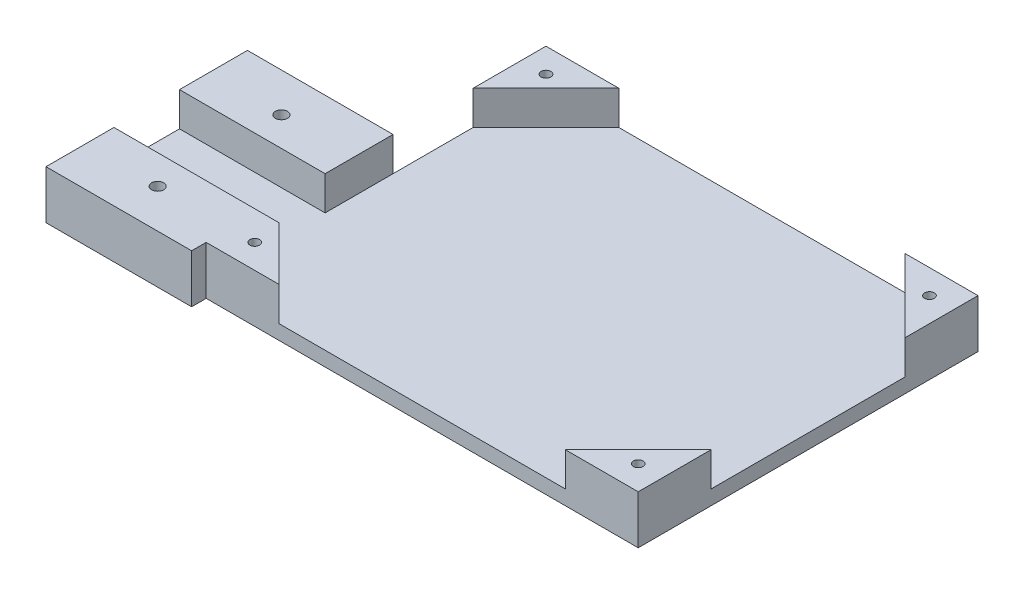
ISO-10303-21;
HEADER;
FILE_DESCRIPTION(('STEP AP214'),'2;1');
FILE_NAME('part.step','',(''),(''),'','','');
FILE_SCHEMA(('AUTOMOTIVE_DESIGN { 1 0 10303 214 1 1 1 1 }'));
ENDSEC;
DATA;
#1=APPLICATION_CONTEXT('core data for automotive mechanical design processes');
#2=APPLICATION_PROTOCOL_DEFINITION('international standard','automotive_design',2000,#1);
#3=PRODUCT_CONTEXT('',#1,'mechanical');
#4=PRODUCT('Part','Part','',(#3));
#5=PRODUCT_RELATED_PRODUCT_CATEGORY('part','',(#4));
#6=PRODUCT_DEFINITION_FORMATION('','',#4);
#7=PRODUCT_DEFINITION_CONTEXT('part definition',#1,'design');
#8=PRODUCT_DEFINITION('design','',#6,#7);
#9=PRODUCT_DEFINITION_SHAPE('','',#8);
#10=(LENGTH_UNIT() NAMED_UNIT(*) SI_UNIT(.MILLI.,.METRE.));
#11=(NAMED_UNIT(*) PLANE_ANGLE_UNIT() SI_UNIT($,.RADIAN.));
#12=(NAMED_UNIT(*) SI_UNIT($,.STERADIAN.) SOLID_ANGLE_UNIT());
#13=UNCERTAINTY_MEASURE_WITH_UNIT(LENGTH_MEASURE(1.E-05),#10,'distance_accuracy_value','');
#14=(GEOMETRIC_REPRESENTATION_CONTEXT(3) GLOBAL_UNCERTAINTY_ASSIGNED_CONTEXT((#13)) GLOBAL_UNIT_ASSIGNED_CONTEXT((#10,
#11,#12)) REPRESENTATION_CONTEXT('',''));
#15=CARTESIAN_POINT('',(0.,0.,0.));
#16=DIRECTION('',(0.,0.,1.));
#17=DIRECTION('',(1.,0.,0.));
#18=AXIS2_PLACEMENT_3D('',#15,#16,#17);
#19=CARTESIAN_POINT('',(0.,10.,0.));
#20=DIRECTION('',(0.,-1.,0.));
#21=DIRECTION('',(0.,0.,-1.));
#22=AXIS2_PLACEMENT_3D('',#19,#20,#21);
#23=PLANE('',#22);
#24=CARTESIAN_POINT('',(-59.5,10.,4.50000000000001));
#25=DIRECTION('',(0.,-1.,0.));
#26=DIRECTION('',(0.,0.,-1.));
#27=AXIS2_PLACEMENT_3D('',#24,#25,#26);
#28=CIRCLE('',#27,1.25);
#29=CARTESIAN_POINT('',(-59.5,10.,3.25));
#30=VERTEX_POINT('',#29);
#31=EDGE_CURVE('E198',#30,#30,#28,.T.);
#32=ORIENTED_EDGE('',*,*,#31,.T.);
#33=EDGE_LOOP('',(#32));
#34=FACE_BOUND('',#33,.T.);
#35=DIRECTION('',(0.,0.,-1.));
#36=VECTOR('',#35,1.);
#37=CARTESIAN_POINT('',(-74.5,10.,-3.49999999999999));
#38=LINE('',#37,#36);
#39=CARTESIAN_POINT('',(-74.5,10.,10.5));
#40=VERTEX_POINT('',#39);
#41=CARTESIAN_POINT('',(-74.5,10.,-3.49999999999999));
#42=VERTEX_POINT('',#41);
#43=EDGE_CURVE('E217',#40,#42,#38,.T.);
#44=ORIENTED_EDGE('',*,*,#43,.F.);
#45=DIRECTION('',(-1.,0.,0.));
#46=VECTOR('',#45,1.);
#47=CARTESIAN_POINT('',(-74.5,10.,10.5));
#48=LINE('',#47,#46);
#49=CARTESIAN_POINT('',(-44.5,10.,10.5));
#50=VERTEX_POINT('',#49);
#51=EDGE_CURVE('E184',#50,#40,#48,.T.);
#52=ORIENTED_EDGE('',*,*,#51,.F.);
#53=DIRECTION('',(0.,0.,1.));
#54=VECTOR('',#53,1.);
#55=CARTESIAN_POINT('',(-44.5,10.,-3.49999999999999));
#56=LINE('',#55,#54);
#57=CARTESIAN_POINT('',(-44.5,10.,-3.49999999999999));
#58=VERTEX_POINT('',#57);
#59=EDGE_CURVE('E210',#58,#50,#56,.T.);
#60=ORIENTED_EDGE('',*,*,#59,.F.);
#61=DIRECTION('',(1.,0.,0.));
#62=VECTOR('',#61,1.);
#63=CARTESIAN_POINT('',(-44.5,10.,-3.49999999999999));
#64=LINE('',#63,#62);
#65=EDGE_CURVE('E219',#42,#58,#64,.T.);
#66=ORIENTED_EDGE('',*,*,#65,.F.);
#67=EDGE_LOOP('',(#44,#52,#60,#66));
#68=FACE_BOUND('',#67,.T.);
#69=ADVANCED_FACE('F33',(#34,#68),#23,.F.);
#70=CARTESIAN_POINT('',(-44.5,10.,35.));
#71=DIRECTION('',(1.,0.,0.));
#72=DIRECTION('',(0.,0.,-1.));
#73=AXIS2_PLACEMENT_3D('',#70,#71,#72);
#74=PLANE('',#73);
#75=DIRECTION('',(0.,-1.,0.));
#76=VECTOR('',#75,1.);
#77=CARTESIAN_POINT('',(-44.5,10.,-3.49999999999999));
#78=LINE('',#77,#76);
#79=CARTESIAN_POINT('',(-44.5,3.,-3.49999999999999));
#80=VERTEX_POINT('',#79);
#81=CARTESIAN_POINT('',(-44.5,0.,-3.49999999999999));
#82=VERTEX_POINT('',#81);
#83=EDGE_CURVE('E11',#80,#82,#78,.T.);
#84=ORIENTED_EDGE('',*,*,#83,.F.);
#85=DIRECTION('',(0.,0.,1.));
#86=VECTOR('',#85,1.);
#87=CARTESIAN_POINT('',(-44.5,3.,-19.9999999999999));
#88=LINE('',#87,#86);
#89=CARTESIAN_POINT('',(-44.5,3.,-19.9999999999999));
#90=VERTEX_POINT('',#89);
#91=EDGE_CURVE('E241',#90,#80,#88,.T.);
#92=ORIENTED_EDGE('',*,*,#91,.F.);
#93=DIRECTION('',(0.,1.,0.));
#94=VECTOR('',#93,1.);
#95=CARTESIAN_POINT('',(-44.5,3.,-19.9999999999999));
#96=LINE('',#95,#94);
#97=CARTESIAN_POINT('',(-44.5,10.,-19.9999999999999));
#98=VERTEX_POINT('',#97);
#99=EDGE_CURVE('E271',#90,#98,#96,.T.);
#100=ORIENTED_EDGE('',*,*,#99,.T.);
#101=DIRECTION('',(0.,0.,1.));
#102=VECTOR('',#101,1.);
#103=CARTESIAN_POINT('',(-44.5,10.,35.));
#104=LINE('',#103,#102);
#105=CARTESIAN_POINT('',(-44.5,10.,-35.));
#106=VERTEX_POINT('',#105);
#107=EDGE_CURVE('E321',#106,#98,#104,.T.);
#108=ORIENTED_EDGE('',*,*,#107,.F.);
#109=DIRECTION('',(0.,-1.,0.));
#110=VECTOR('',#109,1.);
#111=CARTESIAN_POINT('',(-44.5,10.,-35.));
#112=LINE('',#111,#110);
#113=CARTESIAN_POINT('',(-44.5,0.,-35.));
#114=VERTEX_POINT('',#113);
#115=EDGE_CURVE('E340',#106,#114,#112,.T.);
#116=ORIENTED_EDGE('',*,*,#115,.T.);
#117=DIRECTION('',(0.,0.,1.));
#118=VECTOR('',#117,1.);
#119=CARTESIAN_POINT('',(-44.5,0.,35.));
#120=LINE('',#119,#118);
#121=EDGE_CURVE('E333',#114,#82,#120,.T.);
#122=ORIENTED_EDGE('',*,*,#121,.T.);
#123=EDGE_LOOP('',(#84,#92,#100,#108,#116,#122));
#124=FACE_BOUND('',#123,.T.);
#125=ADVANCED_FACE('F362',(#124),#74,.F.);
#126=CARTESIAN_POINT('',(-39.5,10.,-30.));
#127=DIRECTION('',(0.,1.,0.));
#128=DIRECTION('',(0.,0.,1.));
#129=AXIS2_PLACEMENT_3D('',#126,#127,#128);
#130=CIRCLE('',#129,0.999999999999998);
#131=CARTESIAN_POINT('',(-39.5,10.,-29.));
#132=VERTEX_POINT('',#131);
#133=EDGE_CURVE('E307',#132,#132,#130,.T.);
#134=ORIENTED_EDGE('',*,*,#133,.F.);
#135=EDGE_LOOP('',(#134));
#136=FACE_BOUND('',#135,.T.);
#137=ORIENTED_EDGE('',*,*,#107,.T.);
#138=DIRECTION('',(-0.707106781186544,0.,0.707106781186551));
#139=VECTOR('',#138,1.);
#140=CARTESIAN_POINT('',(-29.5000000000001,10.,-35.));
#141=LINE('',#140,#139);
#142=CARTESIAN_POINT('',(-29.5000000000001,10.,-35.));
#143=VERTEX_POINT('',#142);
#144=EDGE_CURVE('E269',#143,#98,#141,.T.);
#145=ORIENTED_EDGE('',*,*,#144,.F.);
#146=DIRECTION('',(-1.,0.,0.));
#147=VECTOR('',#146,1.);
#148=CARTESIAN_POINT('',(-44.5,10.,-35.));
#149=LINE('',#148,#147);
#150=EDGE_CURVE('E316',#143,#106,#149,.T.);
#151=ORIENTED_EDGE('',*,*,#150,.T.);
#152=EDGE_LOOP('',(#137,#145,#151));
#153=FACE_BOUND('',#152,.T.);
#154=ADVANCED_FACE('F412',(#136,#153),#23,.F.);
#155=CARTESIAN_POINT('',(39.5,10.,-30.));
#156=DIRECTION('',(0.,1.,0.));
#157=DIRECTION('',(0.,0.,-1.));
#158=AXIS2_PLACEMENT_3D('',#155,#156,#157);
#159=CIRCLE('',#158,0.999999999999998);
#160=CARTESIAN_POINT('',(39.5,10.,-31.));
#161=VERTEX_POINT('',#160);
#162=EDGE_CURVE('E301',#161,#161,#159,.T.);
#163=ORIENTED_EDGE('',*,*,#162,.F.);
#164=EDGE_LOOP('',(#163));
#165=FACE_BOUND('',#164,.T.);
#166=CARTESIAN_POINT('',(44.5,10.,-35.));
#167=VERTEX_POINT('',#166);
#168=CARTESIAN_POINT('',(29.4999999999999,10.,-35.));
#169=VERTEX_POINT('',#168);
#170=EDGE_CURVE('E318',#167,#169,#149,.T.);
#171=ORIENTED_EDGE('',*,*,#170,.T.);
#172=DIRECTION('',(-0.707106781186549,0.,-0.707106781186546));
#173=VECTOR('',#172,1.);
#174=CARTESIAN_POINT('',(44.5,10.,-20.));
#175=LINE('',#174,#173);
#176=CARTESIAN_POINT('',(44.5,10.,-20.));
#177=VERTEX_POINT('',#176);
#178=EDGE_CURVE('E267',#177,#169,#175,.T.);
#179=ORIENTED_EDGE('',*,*,#178,.F.);
#180=DIRECTION('',(0.,0.,-1.));
#181=VECTOR('',#180,1.);
#182=CARTESIAN_POINT('',(44.5,10.,35.));
#183=LINE('',#182,#181);
#184=EDGE_CURVE('E317',#177,#167,#183,.T.);
#185=ORIENTED_EDGE('',*,*,#184,.T.);
#186=EDGE_LOOP('',(#171,#179,#185));
#187=FACE_BOUND('',#186,.T.);
#188=ADVANCED_FACE('F414',(#165,#187),#23,.F.);
#189=CARTESIAN_POINT('',(39.5,10.,30.));
#190=DIRECTION('',(0.,1.,0.));
#191=DIRECTION('',(0.,0.,1.));
#192=AXIS2_PLACEMENT_3D('',#189,#190,#191);
#193=CIRCLE('',#192,0.999999999999998);
#194=CARTESIAN_POINT('',(39.5,10.,31.));
#195=VERTEX_POINT('',#194);
#196=EDGE_CURVE('E295',#195,#195,#193,.T.);
#197=ORIENTED_EDGE('',*,*,#196,.F.);
#198=EDGE_LOOP('',(#197));
#199=FACE_BOUND('',#198,.T.);
#200=CARTESIAN_POINT('',(44.5,10.,35.));
#201=VERTEX_POINT('',#200);
#202=CARTESIAN_POINT('',(44.5,10.,20.));
#203=VERTEX_POINT('',#202);
#204=EDGE_CURVE('E313',#201,#203,#183,.T.);
#205=ORIENTED_EDGE('',*,*,#204,.T.);
#206=DIRECTION('',(0.707106781186546,0.,-0.707106781186549));
#207=VECTOR('',#206,1.);
#208=CARTESIAN_POINT('',(29.5,10.,35.));
#209=LINE('',#208,#207);
#210=CARTESIAN_POINT('',(29.5,10.,35.));
#211=VERTEX_POINT('',#210);
#212=EDGE_CURVE('E265',#211,#203,#209,.T.);
#213=ORIENTED_EDGE('',*,*,#212,.F.);
#214=DIRECTION('',(1.,0.,0.));
#215=VECTOR('',#214,1.);
#216=CARTESIAN_POINT('',(-44.5,10.,35.));
#217=LINE('',#216,#215);
#218=EDGE_CURVE('E324',#211,#201,#217,.T.);
#219=ORIENTED_EDGE('',*,*,#218,.T.);
#220=EDGE_LOOP('',(#205,#213,#219));
#221=FACE_BOUND('',#220,.T.);
#222=ADVANCED_FACE('F402',(#199,#221),#23,.F.);
#223=DIRECTION('',(0.707106781186549,0.,0.707106781186546));
#224=VECTOR('',#223,1.);
#225=CARTESIAN_POINT('',(-44.5,10.,20.));
#226=LINE('',#225,#224);
#227=CARTESIAN_POINT('',(-40.5,10.,24.));
#228=VERTEX_POINT('',#227);
#229=CARTESIAN_POINT('',(-29.4999999999999,10.,35.));
#230=VERTEX_POINT('',#229);
#231=EDGE_CURVE('E234',#228,#230,#226,.T.);
#232=ORIENTED_EDGE('',*,*,#231,.F.);
#233=DIRECTION('',(1.,0.,0.));
#234=VECTOR('',#233,1.);
#235=CARTESIAN_POINT('',(-74.5,10.,24.));
#236=LINE('',#235,#234);
#237=CARTESIAN_POINT('',(-74.5,10.,24.));
#238=VERTEX_POINT('',#237);
#239=EDGE_CURVE('E375',#238,#228,#236,.T.);
#240=ORIENTED_EDGE('',*,*,#239,.F.);
#241=CARTESIAN_POINT('',(-74.5,10.,38.));
#242=VERTEX_POINT('',#241);
#243=EDGE_CURVE('E189',#242,#238,#38,.T.);
#244=ORIENTED_EDGE('',*,*,#243,.F.);
#245=DIRECTION('',(-1.,0.,0.));
#246=VECTOR('',#245,1.);
#247=CARTESIAN_POINT('',(-44.5,10.,38.));
#248=LINE('',#247,#246);
#249=CARTESIAN_POINT('',(-44.5,10.,38.));
#250=VERTEX_POINT('',#249);
#251=EDGE_CURVE('E213',#250,#242,#248,.T.);
#252=ORIENTED_EDGE('',*,*,#251,.F.);
#253=CARTESIAN_POINT('',(-44.5,10.,35.));
#254=VERTEX_POINT('',#253);
#255=EDGE_CURVE('E214',#254,#250,#56,.T.);
#256=ORIENTED_EDGE('',*,*,#255,.F.);
#257=EDGE_CURVE('E325',#254,#230,#217,.T.);
#258=ORIENTED_EDGE('',*,*,#257,.T.);
#259=EDGE_LOOP('',(#232,#240,#244,#252,#256,#258));
#260=FACE_BOUND('',#259,.T.);
#261=CARTESIAN_POINT('',(-39.5,10.,30.));
#262=DIRECTION('',(0.,1.,0.));
#263=DIRECTION('',(0.,0.,-1.));
#264=AXIS2_PLACEMENT_3D('',#261,#262,#263);
#265=CIRCLE('',#264,0.999999999999998);
#266=CARTESIAN_POINT('',(-39.5,10.,29.));
#267=VERTEX_POINT('',#266);
#268=EDGE_CURVE('E289',#267,#267,#265,.T.);
#269=ORIENTED_EDGE('',*,*,#268,.F.);
#270=EDGE_LOOP('',(#269));
#271=FACE_BOUND('',#270,.T.);
#272=CARTESIAN_POINT('',(-59.5,10.,30.));
#273=DIRECTION('',(0.,-1.,0.));
#274=DIRECTION('',(0.,0.,-1.));
#275=AXIS2_PLACEMENT_3D('',#272,#273,#274);
#276=CIRCLE('',#275,1.25);
#277=CARTESIAN_POINT('',(-59.5,10.,28.75));
#278=VERTEX_POINT('',#277);
#279=EDGE_CURVE('E204',#278,#278,#276,.T.);
#280=ORIENTED_EDGE('',*,*,#279,.T.);
#281=EDGE_LOOP('',(#280));
#282=FACE_BOUND('',#281,.T.);
#283=ADVANCED_FACE('F386',(#260,#271,#282),#23,.F.);
#284=CARTESIAN_POINT('',(0.,0.,0.));
#285=DIRECTION('',(0.,-1.,0.));
#286=DIRECTION('',(0.,0.,-1.));
#287=AXIS2_PLACEMENT_3D('',#284,#285,#286);
#288=PLANE('',#287);
#289=CARTESIAN_POINT('',(39.5,0.,30.));
#290=DIRECTION('',(0.,1.,0.));
#291=DIRECTION('',(0.,0.,1.));
#292=AXIS2_PLACEMENT_3D('',#289,#290,#291);
#293=CIRCLE('',#292,0.999999999999998);
#294=CARTESIAN_POINT('',(39.5,0.,31.));
#295=VERTEX_POINT('',#294);
#296=EDGE_CURVE('E292',#295,#295,#293,.T.);
#297=ORIENTED_EDGE('',*,*,#296,.T.);
#298=EDGE_LOOP('',(#297));
#299=FACE_BOUND('',#298,.T.);
#300=CARTESIAN_POINT('',(-39.5,0.,-30.));
#301=DIRECTION('',(0.,1.,0.));
#302=DIRECTION('',(0.,0.,1.));
#303=AXIS2_PLACEMENT_3D('',#300,#301,#302);
#304=CIRCLE('',#303,0.999999999999998);
#305=CARTESIAN_POINT('',(-39.5,0.,-29.));
#306=VERTEX_POINT('',#305);
#307=EDGE_CURVE('E304',#306,#306,#304,.T.);
#308=ORIENTED_EDGE('',*,*,#307,.T.);
#309=EDGE_LOOP('',(#308));
#310=FACE_BOUND('',#309,.T.);
#311=DIRECTION('',(0.,0.,-1.));
#312=VECTOR('',#311,1.);
#313=CARTESIAN_POINT('',(44.5,0.,35.));
#314=LINE('',#313,#312);
#315=CARTESIAN_POINT('',(44.5,0.,35.));
#316=VERTEX_POINT('',#315);
#317=CARTESIAN_POINT('',(44.5,0.,-35.));
#318=VERTEX_POINT('',#317);
#319=EDGE_CURVE('E310',#316,#318,#314,.T.);
#320=ORIENTED_EDGE('',*,*,#319,.F.);
#321=DIRECTION('',(1.,0.,0.));
#322=VECTOR('',#321,1.);
#323=CARTESIAN_POINT('',(-44.5,0.,35.));
#324=LINE('',#323,#322);
#325=CARTESIAN_POINT('',(-44.5,0.,35.));
#326=VERTEX_POINT('',#325);
#327=EDGE_CURVE('E335',#326,#316,#324,.T.);
#328=ORIENTED_EDGE('',*,*,#327,.F.);
#329=DIRECTION('',(0.,0.,1.));
#330=VECTOR('',#329,1.);
#331=CARTESIAN_POINT('',(-44.5,0.,-3.49999999999999));
#332=LINE('',#331,#330);
#333=CARTESIAN_POINT('',(-44.5,0.,38.));
#334=VERTEX_POINT('',#333);
#335=EDGE_CURVE('E207',#326,#334,#332,.T.);
#336=ORIENTED_EDGE('',*,*,#335,.T.);
#337=DIRECTION('',(-1.,0.,0.));
#338=VECTOR('',#337,1.);
#339=CARTESIAN_POINT('',(-44.5,0.,38.));
#340=LINE('',#339,#338);
#341=CARTESIAN_POINT('',(-74.5,0.,38.));
#342=VERTEX_POINT('',#341);
#343=EDGE_CURVE('E224',#334,#342,#340,.T.);
#344=ORIENTED_EDGE('',*,*,#343,.T.);
#345=DIRECTION('',(0.,0.,-1.));
#346=VECTOR('',#345,1.);
#347=CARTESIAN_POINT('',(-74.5,0.,-3.49999999999999));
#348=LINE('',#347,#346);
#349=CARTESIAN_POINT('',(-74.5,0.,-3.49999999999999));
#350=VERTEX_POINT('',#349);
#351=EDGE_CURVE('E227',#342,#350,#348,.T.);
#352=ORIENTED_EDGE('',*,*,#351,.T.);
#353=DIRECTION('',(1.,0.,0.));
#354=VECTOR('',#353,1.);
#355=CARTESIAN_POINT('',(-44.5,0.,-3.49999999999999));
#356=LINE('',#355,#354);
#357=EDGE_CURVE('E230',#350,#82,#356,.T.);
#358=ORIENTED_EDGE('',*,*,#357,.T.);
#359=ORIENTED_EDGE('',*,*,#121,.F.);
#360=DIRECTION('',(-1.,0.,0.));
#361=VECTOR('',#360,1.);
#362=CARTESIAN_POINT('',(-44.5,0.,-35.));
#363=LINE('',#362,#361);
#364=EDGE_CURVE('E331',#318,#114,#363,.T.);
#365=ORIENTED_EDGE('',*,*,#364,.F.);
#366=EDGE_LOOP('',(#320,#328,#336,#344,#352,#358,#359,#365));
#367=FACE_BOUND('',#366,.T.);
#368=CARTESIAN_POINT('',(39.5,0.,-30.));
#369=DIRECTION('',(0.,1.,0.));
#370=DIRECTION('',(0.,0.,-1.));
#371=AXIS2_PLACEMENT_3D('',#368,#369,#370);
#372=CIRCLE('',#371,0.999999999999998);
#373=CARTESIAN_POINT('',(39.5,0.,-31.));
#374=VERTEX_POINT('',#373);
#375=EDGE_CURVE('E298',#374,#374,#372,.T.);
#376=ORIENTED_EDGE('',*,*,#375,.T.);
#377=EDGE_LOOP('',(#376));
#378=FACE_BOUND('',#377,.T.);
#379=CARTESIAN_POINT('',(-39.5,0.,30.));
#380=DIRECTION('',(0.,1.,0.));
#381=DIRECTION('',(0.,0.,-1.));
#382=AXIS2_PLACEMENT_3D('',#379,#380,#381);
#383=CIRCLE('',#382,0.999999999999998);
#384=CARTESIAN_POINT('',(-39.5,0.,29.));
#385=VERTEX_POINT('',#384);
#386=EDGE_CURVE('E274',#385,#385,#383,.T.);
#387=ORIENTED_EDGE('',*,*,#386,.T.);
#388=EDGE_LOOP('',(#387));
#389=FACE_BOUND('',#388,.T.);
#390=CARTESIAN_POINT('',(-59.5,0.,4.50000000000001));
#391=DIRECTION('',(0.,-1.,0.));
#392=DIRECTION('',(0.,0.,-1.));
#393=AXIS2_PLACEMENT_3D('',#390,#391,#392);
#394=CIRCLE('',#393,1.25);
#395=CARTESIAN_POINT('',(-59.5,0.,3.25));
#396=VERTEX_POINT('',#395);
#397=EDGE_CURVE('E197',#396,#396,#394,.T.);
#398=ORIENTED_EDGE('',*,*,#397,.F.);
#399=EDGE_LOOP('',(#398));
#400=FACE_BOUND('',#399,.T.);
#401=CARTESIAN_POINT('',(-59.5,0.,30.));
#402=DIRECTION('',(0.,-1.,0.));
#403=DIRECTION('',(0.,0.,-1.));
#404=AXIS2_PLACEMENT_3D('',#401,#402,#403);
#405=CIRCLE('',#404,1.25);
#406=CARTESIAN_POINT('',(-59.5,0.,28.75));
#407=VERTEX_POINT('',#406);
#408=EDGE_CURVE('E201',#407,#407,#405,.T.);
#409=ORIENTED_EDGE('',*,*,#408,.F.);
#410=EDGE_LOOP('',(#409));
#411=FACE_BOUND('',#410,.T.);
#412=ADVANCED_FACE('F358',(#299,#310,#367,#378,#389,#400,#411),#288,.T.);
#413=CARTESIAN_POINT('',(44.5,10.,35.));
#414=DIRECTION('',(-1.,0.,0.));
#415=DIRECTION('',(0.,0.,1.));
#416=AXIS2_PLACEMENT_3D('',#413,#414,#415);
#417=PLANE('',#416);
#418=ORIENTED_EDGE('',*,*,#184,.F.);
#419=DIRECTION('',(0.,1.,0.));
#420=VECTOR('',#419,1.);
#421=CARTESIAN_POINT('',(44.5,3.,-20.));
#422=LINE('',#421,#420);
#423=CARTESIAN_POINT('',(44.5,3.,-20.));
#424=VERTEX_POINT('',#423);
#425=EDGE_CURVE('E280',#424,#177,#422,.T.);
#426=ORIENTED_EDGE('',*,*,#425,.F.);
#427=DIRECTION('',(0.,0.,-1.));
#428=VECTOR('',#427,1.);
#429=CARTESIAN_POINT('',(44.5,3.,20.));
#430=LINE('',#429,#428);
#431=CARTESIAN_POINT('',(44.5,3.,20.));
#432=VERTEX_POINT('',#431);
#433=EDGE_CURVE('E252',#432,#424,#430,.T.);
#434=ORIENTED_EDGE('',*,*,#433,.F.);
#435=DIRECTION('',(0.,1.,0.));
#436=VECTOR('',#435,1.);
#437=CARTESIAN_POINT('',(44.5,3.,20.));
#438=LINE('',#437,#436);
#439=EDGE_CURVE('E282',#432,#203,#438,.T.);
#440=ORIENTED_EDGE('',*,*,#439,.T.);
#441=ORIENTED_EDGE('',*,*,#204,.F.);
#442=DIRECTION('',(0.,-1.,0.));
#443=VECTOR('',#442,1.);
#444=CARTESIAN_POINT('',(44.5,10.,35.));
#445=LINE('',#444,#443);
#446=EDGE_CURVE('E328',#201,#316,#445,.T.);
#447=ORIENTED_EDGE('',*,*,#446,.T.);
#448=ORIENTED_EDGE('',*,*,#319,.T.);
#449=DIRECTION('',(0.,-1.,0.));
#450=VECTOR('',#449,1.);
#451=CARTESIAN_POINT('',(44.5,10.,-35.));
#452=LINE('',#451,#450);
#453=EDGE_CURVE('E37',#167,#318,#452,.T.);
#454=ORIENTED_EDGE('',*,*,#453,.F.);
#455=EDGE_LOOP('',(#418,#426,#434,#440,#441,#447,#448,#454));
#456=FACE_BOUND('',#455,.T.);
#457=ADVANCED_FACE('F35',(#456),#417,.F.);
#458=CARTESIAN_POINT('',(-44.5,10.,-35.));
#459=DIRECTION('',(0.,0.,1.));
#460=DIRECTION('',(1.,0.,0.));
#461=AXIS2_PLACEMENT_3D('',#458,#459,#460);
#462=PLANE('',#461);
#463=ORIENTED_EDGE('',*,*,#150,.F.);
#464=DIRECTION('',(0.,1.,0.));
#465=VECTOR('',#464,1.);
#466=CARTESIAN_POINT('',(-29.5000000000001,3.,-35.));
#467=LINE('',#466,#465);
#468=CARTESIAN_POINT('',(-29.5000000000001,3.,-35.));
#469=VERTEX_POINT('',#468);
#470=EDGE_CURVE('E275',#469,#143,#467,.T.);
#471=ORIENTED_EDGE('',*,*,#470,.F.);
#472=DIRECTION('',(-1.,0.,0.));
#473=VECTOR('',#472,1.);
#474=CARTESIAN_POINT('',(29.4999999999999,3.,-35.));
#475=LINE('',#474,#473);
#476=CARTESIAN_POINT('',(29.4999999999999,3.,-35.));
#477=VERTEX_POINT('',#476);
#478=EDGE_CURVE('E258',#477,#469,#475,.T.);
#479=ORIENTED_EDGE('',*,*,#478,.F.);
#480=DIRECTION('',(0.,1.,0.));
#481=VECTOR('',#480,1.);
#482=CARTESIAN_POINT('',(29.4999999999999,3.,-35.));
#483=LINE('',#482,#481);
#484=EDGE_CURVE('E277',#477,#169,#483,.T.);
#485=ORIENTED_EDGE('',*,*,#484,.T.);
#486=ORIENTED_EDGE('',*,*,#170,.F.);
#487=ORIENTED_EDGE('',*,*,#453,.T.);
#488=ORIENTED_EDGE('',*,*,#364,.T.);
#489=ORIENTED_EDGE('',*,*,#115,.F.);
#490=EDGE_LOOP('',(#463,#471,#479,#485,#486,#487,#488,#489));
#491=FACE_BOUND('',#490,.T.);
#492=ADVANCED_FACE('F350',(#491),#462,.F.);
#493=CARTESIAN_POINT('',(-44.5,10.,35.));
#494=DIRECTION('',(0.,0.,-1.));
#495=DIRECTION('',(-1.,0.,0.));
#496=AXIS2_PLACEMENT_3D('',#493,#494,#495);
#497=PLANE('',#496);
#498=ORIENTED_EDGE('',*,*,#218,.F.);
#499=DIRECTION('',(0.,1.,0.));
#500=VECTOR('',#499,1.);
#501=CARTESIAN_POINT('',(29.5,3.,35.));
#502=LINE('',#501,#500);
#503=CARTESIAN_POINT('',(29.5,3.,35.));
#504=VERTEX_POINT('',#503);
#505=EDGE_CURVE('E285',#504,#211,#502,.T.);
#506=ORIENTED_EDGE('',*,*,#505,.F.);
#507=DIRECTION('',(1.,0.,0.));
#508=VECTOR('',#507,1.);
#509=CARTESIAN_POINT('',(-29.4999999999999,3.,35.));
#510=LINE('',#509,#508);
#511=CARTESIAN_POINT('',(-29.4999999999999,3.,35.));
#512=VERTEX_POINT('',#511);
#513=EDGE_CURVE('E246',#512,#504,#510,.T.);
#514=ORIENTED_EDGE('',*,*,#513,.F.);
#515=DIRECTION('',(0.,1.,0.));
#516=VECTOR('',#515,1.);
#517=CARTESIAN_POINT('',(-29.4999999999999,3.,35.));
#518=LINE('',#517,#516);
#519=EDGE_CURVE('E263',#512,#230,#518,.T.);
#520=ORIENTED_EDGE('',*,*,#519,.T.);
#521=ORIENTED_EDGE('',*,*,#257,.F.);
#522=DIRECTION('',(0.,-1.,0.));
#523=VECTOR('',#522,1.);
#524=CARTESIAN_POINT('',(-44.5,10.,35.));
#525=LINE('',#524,#523);
#526=EDGE_CURVE('E339',#254,#326,#525,.T.);
#527=ORIENTED_EDGE('',*,*,#526,.T.);
#528=ORIENTED_EDGE('',*,*,#327,.T.);
#529=ORIENTED_EDGE('',*,*,#446,.F.);
#530=EDGE_LOOP('',(#498,#506,#514,#520,#521,#527,#528,#529));
#531=FACE_BOUND('',#530,.T.);
#532=ADVANCED_FACE('F397',(#531),#497,.F.);
#533=CARTESIAN_POINT('',(-39.5,10.,-30.));
#534=DIRECTION('',(0.,-1.,0.));
#535=DIRECTION('',(0.,0.,-1.));
#536=AXIS2_PLACEMENT_3D('',#533,#534,#535);
#537=CYLINDRICAL_SURFACE('',#536,0.999999999999998);
#538=ORIENTED_EDGE('',*,*,#133,.T.);
#539=EDGE_LOOP('',(#538));
#540=FACE_BOUND('',#539,.T.);
#541=ORIENTED_EDGE('',*,*,#307,.F.);
#542=EDGE_LOOP('',(#541));
#543=FACE_BOUND('',#542,.T.);
#544=ADVANCED_FACE('F453',(#540,#543),#537,.F.);
#545=CARTESIAN_POINT('',(39.5,10.,-30.));
#546=DIRECTION('',(0.,-1.,0.));
#547=DIRECTION('',(0.,0.,-1.));
#548=AXIS2_PLACEMENT_3D('',#545,#546,#547);
#549=CYLINDRICAL_SURFACE('',#548,0.999999999999998);
#550=ORIENTED_EDGE('',*,*,#162,.T.);
#551=EDGE_LOOP('',(#550));
#552=FACE_BOUND('',#551,.T.);
#553=ORIENTED_EDGE('',*,*,#375,.F.);
#554=EDGE_LOOP('',(#553));
#555=FACE_BOUND('',#554,.T.);
#556=ADVANCED_FACE('F447',(#552,#555),#549,.F.);
#557=CARTESIAN_POINT('',(39.5,10.,30.));
#558=DIRECTION('',(0.,-1.,0.));
#559=DIRECTION('',(0.,0.,-1.));
#560=AXIS2_PLACEMENT_3D('',#557,#558,#559);
#561=CYLINDRICAL_SURFACE('',#560,0.999999999999998);
#562=ORIENTED_EDGE('',*,*,#196,.T.);
#563=EDGE_LOOP('',(#562));
#564=FACE_BOUND('',#563,.T.);
#565=ORIENTED_EDGE('',*,*,#296,.F.);
#566=EDGE_LOOP('',(#565));
#567=FACE_BOUND('',#566,.T.);
#568=ADVANCED_FACE('F443',(#564,#567),#561,.F.);
#569=CARTESIAN_POINT('',(-39.5,10.,30.));
#570=DIRECTION('',(0.,-1.,0.));
#571=DIRECTION('',(0.,0.,-1.));
#572=AXIS2_PLACEMENT_3D('',#569,#570,#571);
#573=CYLINDRICAL_SURFACE('',#572,0.999999999999998);
#574=ORIENTED_EDGE('',*,*,#268,.T.);
#575=EDGE_LOOP('',(#574));
#576=FACE_BOUND('',#575,.T.);
#577=ORIENTED_EDGE('',*,*,#386,.F.);
#578=EDGE_LOOP('',(#577));
#579=FACE_BOUND('',#578,.T.);
#580=ADVANCED_FACE('F446',(#576,#579),#573,.F.);
#581=CARTESIAN_POINT('',(-29.5000000000001,3.,-35.));
#582=DIRECTION('',(-0.707106781186551,0.,-0.707106781186544));
#583=DIRECTION('',(-0.707106781186544,0.,0.707106781186551));
#584=AXIS2_PLACEMENT_3D('',#581,#582,#583);
#585=PLANE('',#584);
#586=ORIENTED_EDGE('',*,*,#144,.T.);
#587=ORIENTED_EDGE('',*,*,#99,.F.);
#588=DIRECTION('',(-0.707106781186544,0.,0.707106781186551));
#589=VECTOR('',#588,1.);
#590=CARTESIAN_POINT('',(-29.5000000000001,3.,-35.));
#591=LINE('',#590,#589);
#592=EDGE_CURVE('E260',#469,#90,#591,.T.);
#593=ORIENTED_EDGE('',*,*,#592,.F.);
#594=ORIENTED_EDGE('',*,*,#470,.T.);
#595=EDGE_LOOP('',(#586,#587,#593,#594));
#596=FACE_BOUND('',#595,.T.);
#597=ADVANCED_FACE('F410',(#596),#585,.F.);
#598=CARTESIAN_POINT('',(44.5,3.,-20.));
#599=DIRECTION('',(0.707106781186546,0.,-0.707106781186549));
#600=DIRECTION('',(-0.707106781186549,0.,-0.707106781186546));
#601=AXIS2_PLACEMENT_3D('',#598,#599,#600);
#602=PLANE('',#601);
#603=ORIENTED_EDGE('',*,*,#178,.T.);
#604=ORIENTED_EDGE('',*,*,#484,.F.);
#605=DIRECTION('',(-0.707106781186549,0.,-0.707106781186546));
#606=VECTOR('',#605,1.);
#607=CARTESIAN_POINT('',(44.5,3.,-20.));
#608=LINE('',#607,#606);
#609=EDGE_CURVE('E255',#424,#477,#608,.T.);
#610=ORIENTED_EDGE('',*,*,#609,.F.);
#611=ORIENTED_EDGE('',*,*,#425,.T.);
#612=EDGE_LOOP('',(#603,#604,#610,#611));
#613=FACE_BOUND('',#612,.T.);
#614=ADVANCED_FACE('F472',(#613),#602,.F.);
#615=CARTESIAN_POINT('',(29.5,3.,35.));
#616=DIRECTION('',(0.707106781186549,0.,0.707106781186546));
#617=DIRECTION('',(0.707106781186546,0.,-0.707106781186549));
#618=AXIS2_PLACEMENT_3D('',#615,#616,#617);
#619=PLANE('',#618);
#620=ORIENTED_EDGE('',*,*,#212,.T.);
#621=ORIENTED_EDGE('',*,*,#439,.F.);
#622=DIRECTION('',(0.707106781186546,0.,-0.707106781186549));
#623=VECTOR('',#622,1.);
#624=CARTESIAN_POINT('',(29.5,3.,35.));
#625=LINE('',#624,#623);
#626=EDGE_CURVE('E249',#504,#432,#625,.T.);
#627=ORIENTED_EDGE('',*,*,#626,.F.);
#628=ORIENTED_EDGE('',*,*,#505,.T.);
#629=EDGE_LOOP('',(#620,#621,#627,#628));
#630=FACE_BOUND('',#629,.T.);
#631=ADVANCED_FACE('F400',(#630),#619,.F.);
#632=CARTESIAN_POINT('',(-44.5,3.,20.));
#633=DIRECTION('',(-0.707106781186546,0.,0.707106781186549));
#634=DIRECTION('',(0.707106781186549,0.,0.707106781186546));
#635=AXIS2_PLACEMENT_3D('',#632,#633,#634);
#636=PLANE('',#635);
#637=DIRECTION('',(0.707106781186549,0.,0.707106781186546));
#638=VECTOR('',#637,1.);
#639=CARTESIAN_POINT('',(-44.5,3.,20.));
#640=LINE('',#639,#638);
#641=CARTESIAN_POINT('',(-40.5,3.,24.));
#642=VERTEX_POINT('',#641);
#643=EDGE_CURVE('E243',#642,#512,#640,.T.);
#644=ORIENTED_EDGE('',*,*,#643,.F.);
#645=DIRECTION('',(0.,1.,0.));
#646=VECTOR('',#645,1.);
#647=CARTESIAN_POINT('',(-40.5,3.,24.));
#648=LINE('',#647,#646);
#649=EDGE_CURVE('E174',#642,#228,#648,.T.);
#650=ORIENTED_EDGE('',*,*,#649,.T.);
#651=ORIENTED_EDGE('',*,*,#231,.T.);
#652=ORIENTED_EDGE('',*,*,#519,.F.);
#653=EDGE_LOOP('',(#644,#650,#651,#652));
#654=FACE_BOUND('',#653,.T.);
#655=ADVANCED_FACE('F390',(#654),#636,.F.);
#656=CARTESIAN_POINT('',(0.,3.,0.));
#657=DIRECTION('',(0.,1.,0.));
#658=DIRECTION('',(0.,0.,1.));
#659=AXIS2_PLACEMENT_3D('',#656,#657,#658);
#660=PLANE('',#659);
#661=DIRECTION('',(1.,0.,0.));
#662=VECTOR('',#661,1.);
#663=CARTESIAN_POINT('',(-74.5,3.,24.));
#664=LINE('',#663,#662);
#665=CARTESIAN_POINT('',(-74.5,3.,24.));
#666=VERTEX_POINT('',#665);
#667=EDGE_CURVE('E167',#666,#642,#664,.T.);
#668=ORIENTED_EDGE('',*,*,#667,.T.);
#669=ORIENTED_EDGE('',*,*,#643,.T.);
#670=ORIENTED_EDGE('',*,*,#513,.T.);
#671=ORIENTED_EDGE('',*,*,#626,.T.);
#672=ORIENTED_EDGE('',*,*,#433,.T.);
#673=ORIENTED_EDGE('',*,*,#609,.T.);
#674=ORIENTED_EDGE('',*,*,#478,.T.);
#675=ORIENTED_EDGE('',*,*,#592,.T.);
#676=ORIENTED_EDGE('',*,*,#91,.T.);
#677=CARTESIAN_POINT('',(-44.5,3.,10.5));
#678=VERTEX_POINT('',#677);
#679=EDGE_CURVE('E244',#80,#678,#88,.T.);
#680=ORIENTED_EDGE('',*,*,#679,.T.);
#681=DIRECTION('',(-1.,0.,0.));
#682=VECTOR('',#681,1.);
#683=CARTESIAN_POINT('',(-74.5,3.,10.5));
#684=LINE('',#683,#682);
#685=CARTESIAN_POINT('',(-74.5,3.,10.5));
#686=VERTEX_POINT('',#685);
#687=EDGE_CURVE('E177',#678,#686,#684,.T.);
#688=ORIENTED_EDGE('',*,*,#687,.T.);
#689=DIRECTION('',(0.,0.,1.));
#690=VECTOR('',#689,1.);
#691=CARTESIAN_POINT('',(-74.5,3.,10.5));
#692=LINE('',#691,#690);
#693=EDGE_CURVE('E178',#686,#666,#692,.T.);
#694=ORIENTED_EDGE('',*,*,#693,.T.);
#695=EDGE_LOOP('',(#668,#669,#670,#671,#672,#673,#674,#675,#676,#680,#688,#694));
#696=FACE_BOUND('',#695,.T.);
#697=ADVANCED_FACE('F181',(#696),#660,.T.);
#698=CARTESIAN_POINT('',(-44.5,10.,-3.49999999999999));
#699=DIRECTION('',(1.,0.,0.));
#700=DIRECTION('',(0.,0.,-1.));
#701=AXIS2_PLACEMENT_3D('',#698,#699,#700);
#702=PLANE('',#701);
#703=ORIENTED_EDGE('',*,*,#526,.F.);
#704=ORIENTED_EDGE('',*,*,#255,.T.);
#705=DIRECTION('',(0.,-1.,0.));
#706=VECTOR('',#705,1.);
#707=CARTESIAN_POINT('',(-44.5,10.,38.));
#708=LINE('',#707,#706);
#709=EDGE_CURVE('E222',#250,#334,#708,.T.);
#710=ORIENTED_EDGE('',*,*,#709,.T.);
#711=ORIENTED_EDGE('',*,*,#335,.F.);
#712=EDGE_LOOP('',(#703,#704,#710,#711));
#713=FACE_BOUND('',#712,.T.);
#714=ADVANCED_FACE('F479',(#713),#702,.T.);
#715=DIRECTION('',(0.,1.,0.));
#716=VECTOR('',#715,1.);
#717=CARTESIAN_POINT('',(-44.5,10.,10.5));
#718=LINE('',#717,#716);
#719=EDGE_CURVE('E195',#678,#50,#718,.T.);
#720=ORIENTED_EDGE('',*,*,#719,.F.);
#721=ORIENTED_EDGE('',*,*,#679,.F.);
#722=EDGE_CURVE('E43',#58,#80,#78,.T.);
#723=ORIENTED_EDGE('',*,*,#722,.F.);
#724=ORIENTED_EDGE('',*,*,#59,.T.);
#725=EDGE_LOOP('',(#720,#721,#723,#724));
#726=FACE_BOUND('',#725,.T.);
#727=ADVANCED_FACE('F371',(#726),#702,.T.);
#728=CARTESIAN_POINT('',(-44.5,10.,-3.49999999999999));
#729=DIRECTION('',(0.,0.,-1.));
#730=DIRECTION('',(-1.,0.,0.));
#731=AXIS2_PLACEMENT_3D('',#728,#729,#730);
#732=PLANE('',#731);
#733=ORIENTED_EDGE('',*,*,#357,.F.);
#734=DIRECTION('',(0.,-1.,0.));
#735=VECTOR('',#734,1.);
#736=CARTESIAN_POINT('',(-74.5,10.,-3.49999999999999));
#737=LINE('',#736,#735);
#738=EDGE_CURVE('E235',#42,#350,#737,.T.);
#739=ORIENTED_EDGE('',*,*,#738,.F.);
#740=ORIENTED_EDGE('',*,*,#65,.T.);
#741=ORIENTED_EDGE('',*,*,#722,.T.);
#742=ORIENTED_EDGE('',*,*,#83,.T.);
#743=EDGE_LOOP('',(#733,#739,#740,#741,#742));
#744=FACE_BOUND('',#743,.T.);
#745=ADVANCED_FACE('F364',(#744),#732,.T.);
#746=CARTESIAN_POINT('',(-74.5,10.,-3.49999999999999));
#747=DIRECTION('',(-1.,0.,0.));
#748=DIRECTION('',(0.,0.,1.));
#749=AXIS2_PLACEMENT_3D('',#746,#747,#748);
#750=PLANE('',#749);
#751=DIRECTION('',(0.,1.,0.));
#752=VECTOR('',#751,1.);
#753=CARTESIAN_POINT('',(-74.5,3.,10.5));
#754=LINE('',#753,#752);
#755=EDGE_CURVE('E50',#686,#40,#754,.T.);
#756=ORIENTED_EDGE('',*,*,#755,.T.);
#757=ORIENTED_EDGE('',*,*,#43,.T.);
#758=ORIENTED_EDGE('',*,*,#738,.T.);
#759=ORIENTED_EDGE('',*,*,#351,.F.);
#760=DIRECTION('',(0.,-1.,0.));
#761=VECTOR('',#760,1.);
#762=CARTESIAN_POINT('',(-74.5,10.,38.));
#763=LINE('',#762,#761);
#764=EDGE_CURVE('E237',#242,#342,#763,.T.);
#765=ORIENTED_EDGE('',*,*,#764,.F.);
#766=ORIENTED_EDGE('',*,*,#243,.T.);
#767=DIRECTION('',(0.,1.,0.));
#768=VECTOR('',#767,1.);
#769=CARTESIAN_POINT('',(-74.5,3.,24.));
#770=LINE('',#769,#768);
#771=EDGE_CURVE('E171',#666,#238,#770,.T.);
#772=ORIENTED_EDGE('',*,*,#771,.F.);
#773=ORIENTED_EDGE('',*,*,#693,.F.);
#774=EDGE_LOOP('',(#756,#757,#758,#759,#765,#766,#772,#773));
#775=FACE_BOUND('',#774,.T.);
#776=ADVANCED_FACE('F187',(#775),#750,.T.);
#777=CARTESIAN_POINT('',(-44.5,10.,38.));
#778=DIRECTION('',(0.,0.,1.));
#779=DIRECTION('',(1.,0.,0.));
#780=AXIS2_PLACEMENT_3D('',#777,#778,#779);
#781=PLANE('',#780);
#782=ORIENTED_EDGE('',*,*,#343,.F.);
#783=ORIENTED_EDGE('',*,*,#709,.F.);
#784=ORIENTED_EDGE('',*,*,#251,.T.);
#785=ORIENTED_EDGE('',*,*,#764,.T.);
#786=EDGE_LOOP('',(#782,#783,#784,#785));
#787=FACE_BOUND('',#786,.T.);
#788=ADVANCED_FACE('F382',(#787),#781,.T.);
#789=CARTESIAN_POINT('',(-59.5,10.,30.));
#790=DIRECTION('',(0.,-1.,0.));
#791=DIRECTION('',(0.,0.,-1.));
#792=AXIS2_PLACEMENT_3D('',#789,#790,#791);
#793=CYLINDRICAL_SURFACE('',#792,1.25);
#794=ORIENTED_EDGE('',*,*,#279,.F.);
#795=EDGE_LOOP('',(#794));
#796=FACE_BOUND('',#795,.T.);
#797=ORIENTED_EDGE('',*,*,#408,.T.);
#798=EDGE_LOOP('',(#797));
#799=FACE_BOUND('',#798,.T.);
#800=ADVANCED_FACE('F485',(#796,#799),#793,.F.);
#801=CARTESIAN_POINT('',(-59.5,10.,4.50000000000001));
#802=DIRECTION('',(0.,-1.,0.));
#803=DIRECTION('',(0.,0.,-1.));
#804=AXIS2_PLACEMENT_3D('',#801,#802,#803);
#805=CYLINDRICAL_SURFACE('',#804,1.25);
#806=ORIENTED_EDGE('',*,*,#31,.F.);
#807=EDGE_LOOP('',(#806));
#808=FACE_BOUND('',#807,.T.);
#809=ORIENTED_EDGE('',*,*,#397,.T.);
#810=EDGE_LOOP('',(#809));
#811=FACE_BOUND('',#810,.T.);
#812=ADVANCED_FACE('F492',(#808,#811),#805,.F.);
#813=CARTESIAN_POINT('',(-74.5,3.,10.5));
#814=DIRECTION('',(0.,0.,-1.));
#815=DIRECTION('',(-1.,0.,0.));
#816=AXIS2_PLACEMENT_3D('',#813,#814,#815);
#817=PLANE('',#816);
#818=ORIENTED_EDGE('',*,*,#719,.T.);
#819=ORIENTED_EDGE('',*,*,#51,.T.);
#820=ORIENTED_EDGE('',*,*,#755,.F.);
#821=ORIENTED_EDGE('',*,*,#687,.F.);
#822=EDGE_LOOP('',(#818,#819,#820,#821));
#823=FACE_BOUND('',#822,.T.);
#824=ADVANCED_FACE('F496',(#823),#817,.F.);
#825=CARTESIAN_POINT('',(-74.5,3.,24.));
#826=DIRECTION('',(0.,0.,1.));
#827=DIRECTION('',(1.,0.,0.));
#828=AXIS2_PLACEMENT_3D('',#825,#826,#827);
#829=PLANE('',#828);
#830=ORIENTED_EDGE('',*,*,#239,.T.);
#831=ORIENTED_EDGE('',*,*,#649,.F.);
#832=ORIENTED_EDGE('',*,*,#667,.F.);
#833=ORIENTED_EDGE('',*,*,#771,.T.);
#834=EDGE_LOOP('',(#830,#831,#832,#833));
#835=FACE_BOUND('',#834,.T.);
#836=ADVANCED_FACE('F169',(#835),#829,.F.);
#837=CLOSED_SHELL('',(#69,#125,#154,#188,#222,#283,#412,#457,#492,#532,#544,#556,#568,#580,#597,
#614,#631,#655,#697,#714,#727,#745,#776,#788,#800,#812,#824,#836));
#838=MANIFOLD_SOLID_BREP('B2',#837);
#839=ADVANCED_BREP_SHAPE_REPRESENTATION('',(#18,#838),#14);
#840=SHAPE_DEFINITION_REPRESENTATION(#9,#839);
ENDSEC;
END-ISO-10303-21;
